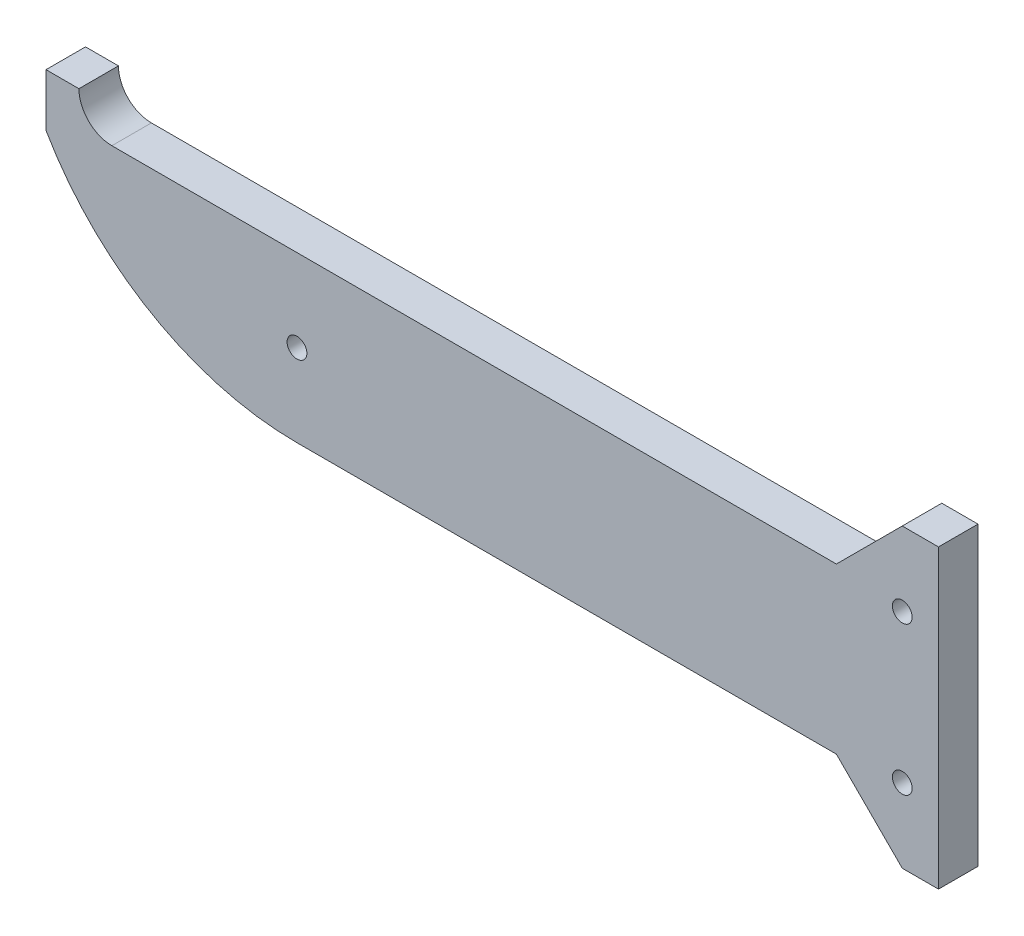
ISO-10303-21;
HEADER;
FILE_DESCRIPTION(('STEP AP214'),'2;1');
FILE_NAME('part.step','',(''),(''),'','','');
FILE_SCHEMA(('AUTOMOTIVE_DESIGN { 1 0 10303 214 1 1 1 1 }'));
ENDSEC;
DATA;
#1=APPLICATION_CONTEXT('core data for automotive mechanical design processes');
#2=APPLICATION_PROTOCOL_DEFINITION('international standard','automotive_design',2000,#1);
#3=PRODUCT_CONTEXT('',#1,'mechanical');
#4=PRODUCT('Part','Part','',(#3));
#5=PRODUCT_RELATED_PRODUCT_CATEGORY('part','',(#4));
#6=PRODUCT_DEFINITION_FORMATION('','',#4);
#7=PRODUCT_DEFINITION_CONTEXT('part definition',#1,'design');
#8=PRODUCT_DEFINITION('design','',#6,#7);
#9=PRODUCT_DEFINITION_SHAPE('','',#8);
#10=(LENGTH_UNIT() NAMED_UNIT(*) SI_UNIT(.MILLI.,.METRE.));
#11=(NAMED_UNIT(*) PLANE_ANGLE_UNIT() SI_UNIT($,.RADIAN.));
#12=(NAMED_UNIT(*) SI_UNIT($,.STERADIAN.) SOLID_ANGLE_UNIT());
#13=UNCERTAINTY_MEASURE_WITH_UNIT(LENGTH_MEASURE(1.E-05),#10,'distance_accuracy_value','');
#14=(GEOMETRIC_REPRESENTATION_CONTEXT(3) GLOBAL_UNCERTAINTY_ASSIGNED_CONTEXT((#13)) GLOBAL_UNIT_ASSIGNED_CONTEXT((#10,
#11,#12)) REPRESENTATION_CONTEXT('',''));
#15=CARTESIAN_POINT('',(0.,0.,0.));
#16=DIRECTION('',(0.,0.,1.));
#17=DIRECTION('',(1.,0.,0.));
#18=AXIS2_PLACEMENT_3D('',#15,#16,#17);
#19=CARTESIAN_POINT('',(38.1051177665153,19.,6.));
#20=DIRECTION('',(0.,0.,1.));
#21=DIRECTION('',(1.,0.,0.));
#22=AXIS2_PLACEMENT_3D('',#19,#20,#21);
#23=PLANE('',#22);
#24=CARTESIAN_POINT('',(130.,-23.75,6.));
#25=DIRECTION('',(0.,0.,1.));
#26=DIRECTION('',(1.,0.,0.));
#27=AXIS2_PLACEMENT_3D('',#24,#25,#26);
#28=CIRCLE('',#27,1.5);
#29=CARTESIAN_POINT('',(131.5,-23.75,6.));
#30=VERTEX_POINT('',#29);
#31=EDGE_CURVE('E237',#30,#30,#28,.T.);
#32=ORIENTED_EDGE('',*,*,#31,.F.);
#33=EDGE_LOOP('',(#32));
#34=FACE_BOUND('',#33,.T.);
#35=CARTESIAN_POINT('',(38.1051177665153,19.,6.));
#36=DIRECTION('',(0.,0.,1.));
#37=DIRECTION('',(1.,0.,0.));
#38=AXIS2_PLACEMENT_3D('',#35,#36,#37);
#39=CIRCLE('',#38,44.);
#40=CARTESIAN_POINT('',(0.,-3.,6.));
#41=VERTEX_POINT('',#40);
#42=CARTESIAN_POINT('',(38.1051177665153,-25.,6.));
#43=VERTEX_POINT('',#42);
#44=EDGE_CURVE('E170',#41,#43,#39,.T.);
#45=ORIENTED_EDGE('',*,*,#44,.T.);
#46=DIRECTION('',(1.,0.,0.));
#47=VECTOR('',#46,1.);
#48=CARTESIAN_POINT('',(120.,-25.,6.));
#49=LINE('',#48,#47);
#50=CARTESIAN_POINT('',(120.,-25.,6.));
#51=VERTEX_POINT('',#50);
#52=EDGE_CURVE('E99',#43,#51,#49,.T.);
#53=ORIENTED_EDGE('',*,*,#52,.T.);
#54=DIRECTION('',(0.707106781186546,-0.707106781186549,0.));
#55=VECTOR('',#54,1.);
#56=CARTESIAN_POINT('',(130.,-35.,6.));
#57=LINE('',#56,#55);
#58=CARTESIAN_POINT('',(130.,-35.,6.));
#59=VERTEX_POINT('',#58);
#60=EDGE_CURVE('E194',#51,#59,#57,.T.);
#61=ORIENTED_EDGE('',*,*,#60,.T.);
#62=DIRECTION('',(1.,0.,0.));
#63=VECTOR('',#62,1.);
#64=CARTESIAN_POINT('',(135.5,-35.,6.));
#65=LINE('',#64,#63);
#66=CARTESIAN_POINT('',(135.5,-35.,6.));
#67=VERTEX_POINT('',#66);
#68=EDGE_CURVE('E211',#59,#67,#65,.T.);
#69=ORIENTED_EDGE('',*,*,#68,.T.);
#70=DIRECTION('',(0.,1.,0.));
#71=VECTOR('',#70,1.);
#72=CARTESIAN_POINT('',(135.5,10.,6.));
#73=LINE('',#72,#71);
#74=CARTESIAN_POINT('',(135.5,10.,6.));
#75=VERTEX_POINT('',#74);
#76=EDGE_CURVE('E208',#67,#75,#73,.T.);
#77=ORIENTED_EDGE('',*,*,#76,.T.);
#78=DIRECTION('',(-1.,0.,0.));
#79=VECTOR('',#78,1.);
#80=CARTESIAN_POINT('',(130.,10.,6.));
#81=LINE('',#80,#79);
#82=CARTESIAN_POINT('',(130.,10.,6.));
#83=VERTEX_POINT('',#82);
#84=EDGE_CURVE('E210',#75,#83,#81,.T.);
#85=ORIENTED_EDGE('',*,*,#84,.T.);
#86=DIRECTION('',(-0.707106781186545,-0.70710678118655,0.));
#87=VECTOR('',#86,1.);
#88=CARTESIAN_POINT('',(120.,0.,6.));
#89=LINE('',#88,#87);
#90=CARTESIAN_POINT('',(120.,0.,6.));
#91=VERTEX_POINT('',#90);
#92=EDGE_CURVE('E213',#83,#91,#89,.T.);
#93=ORIENTED_EDGE('',*,*,#92,.T.);
#94=DIRECTION('',(-1.,0.,0.));
#95=VECTOR('',#94,1.);
#96=CARTESIAN_POINT('',(10.,0.,6.));
#97=LINE('',#96,#95);
#98=CARTESIAN_POINT('',(10.,0.,6.));
#99=VERTEX_POINT('',#98);
#100=EDGE_CURVE('E128',#91,#99,#97,.T.);
#101=ORIENTED_EDGE('',*,*,#100,.T.);
#102=CARTESIAN_POINT('',(10.,5.,6.));
#103=DIRECTION('',(0.,0.,-1.));
#104=DIRECTION('',(1.,0.,0.));
#105=AXIS2_PLACEMENT_3D('',#102,#103,#104);
#106=CIRCLE('',#105,5.);
#107=CARTESIAN_POINT('',(5.,5.,6.));
#108=VERTEX_POINT('',#107);
#109=EDGE_CURVE('E121',#99,#108,#106,.T.);
#110=ORIENTED_EDGE('',*,*,#109,.T.);
#111=DIRECTION('',(-1.,0.,0.));
#112=VECTOR('',#111,1.);
#113=CARTESIAN_POINT('',(0.,5.,6.));
#114=LINE('',#113,#112);
#115=CARTESIAN_POINT('',(0.,5.,6.));
#116=VERTEX_POINT('',#115);
#117=EDGE_CURVE('E125',#108,#116,#114,.T.);
#118=ORIENTED_EDGE('',*,*,#117,.T.);
#119=DIRECTION('',(0.,-1.,0.));
#120=VECTOR('',#119,1.);
#121=CARTESIAN_POINT('',(0.,0.,6.));
#122=LINE('',#121,#120);
#123=EDGE_CURVE('E49',#116,#41,#122,.T.);
#124=ORIENTED_EDGE('',*,*,#123,.T.);
#125=EDGE_LOOP('',(#45,#53,#61,#69,#77,#85,#93,#101,#110,#118,#124));
#126=FACE_BOUND('',#125,.T.);
#127=CARTESIAN_POINT('',(130.,-1.25,6.));
#128=DIRECTION('',(0.,0.,1.));
#129=DIRECTION('',(1.,0.,0.));
#130=AXIS2_PLACEMENT_3D('',#127,#128,#129);
#131=CIRCLE('',#130,1.5);
#132=CARTESIAN_POINT('',(131.5,-1.25,6.));
#133=VERTEX_POINT('',#132);
#134=EDGE_CURVE('E152',#133,#133,#131,.T.);
#135=ORIENTED_EDGE('',*,*,#134,.F.);
#136=EDGE_LOOP('',(#135));
#137=FACE_BOUND('',#136,.T.);
#138=CARTESIAN_POINT('',(38.1051177665153,-12.5,6.));
#139=DIRECTION('',(0.,0.,1.));
#140=DIRECTION('',(1.,0.,0.));
#141=AXIS2_PLACEMENT_3D('',#138,#139,#140);
#142=CIRCLE('',#141,1.5);
#143=CARTESIAN_POINT('',(39.6051177665153,-12.5,6.));
#144=VERTEX_POINT('',#143);
#145=EDGE_CURVE('E243',#144,#144,#142,.T.);
#146=ORIENTED_EDGE('',*,*,#145,.F.);
#147=EDGE_LOOP('',(#146));
#148=FACE_BOUND('',#147,.T.);
#149=ADVANCED_FACE('F32',(#34,#126,#137,#148),#23,.T.);
#150=CARTESIAN_POINT('',(38.1051177665153,19.,0.));
#151=DIRECTION('',(0.,0.,1.));
#152=DIRECTION('',(1.,0.,0.));
#153=AXIS2_PLACEMENT_3D('',#150,#151,#152);
#154=PLANE('',#153);
#155=CARTESIAN_POINT('',(38.1051177665153,19.,0.));
#156=DIRECTION('',(0.,0.,1.));
#157=DIRECTION('',(1.,0.,0.));
#158=AXIS2_PLACEMENT_3D('',#155,#156,#157);
#159=CIRCLE('',#158,44.);
#160=CARTESIAN_POINT('',(0.,-3.,0.));
#161=VERTEX_POINT('',#160);
#162=CARTESIAN_POINT('',(38.1051177665153,-25.,0.));
#163=VERTEX_POINT('',#162);
#164=EDGE_CURVE('E148',#161,#163,#159,.T.);
#165=ORIENTED_EDGE('',*,*,#164,.F.);
#166=DIRECTION('',(0.,-1.,0.));
#167=VECTOR('',#166,1.);
#168=CARTESIAN_POINT('',(0.,0.,0.));
#169=LINE('',#168,#167);
#170=CARTESIAN_POINT('',(0.,5.,0.));
#171=VERTEX_POINT('',#170);
#172=EDGE_CURVE('E87',#171,#161,#169,.T.);
#173=ORIENTED_EDGE('',*,*,#172,.F.);
#174=DIRECTION('',(-1.,0.,0.));
#175=VECTOR('',#174,1.);
#176=CARTESIAN_POINT('',(0.,5.,0.));
#177=LINE('',#176,#175);
#178=CARTESIAN_POINT('',(5.,5.,0.));
#179=VERTEX_POINT('',#178);
#180=EDGE_CURVE('E167',#179,#171,#177,.T.);
#181=ORIENTED_EDGE('',*,*,#180,.F.);
#182=CARTESIAN_POINT('',(10.,5.,0.));
#183=DIRECTION('',(0.,0.,-1.));
#184=DIRECTION('',(1.,0.,0.));
#185=AXIS2_PLACEMENT_3D('',#182,#183,#184);
#186=CIRCLE('',#185,5.);
#187=CARTESIAN_POINT('',(10.,0.,0.));
#188=VERTEX_POINT('',#187);
#189=EDGE_CURVE('E137',#188,#179,#186,.T.);
#190=ORIENTED_EDGE('',*,*,#189,.F.);
#191=DIRECTION('',(-1.,0.,0.));
#192=VECTOR('',#191,1.);
#193=CARTESIAN_POINT('',(10.,0.,0.));
#194=LINE('',#193,#192);
#195=CARTESIAN_POINT('',(120.,0.,0.));
#196=VERTEX_POINT('',#195);
#197=EDGE_CURVE('E164',#196,#188,#194,.T.);
#198=ORIENTED_EDGE('',*,*,#197,.F.);
#199=DIRECTION('',(-0.707106781186545,-0.70710678118655,0.));
#200=VECTOR('',#199,1.);
#201=CARTESIAN_POINT('',(120.,0.,0.));
#202=LINE('',#201,#200);
#203=CARTESIAN_POINT('',(130.,10.,0.));
#204=VERTEX_POINT('',#203);
#205=EDGE_CURVE('E162',#204,#196,#202,.T.);
#206=ORIENTED_EDGE('',*,*,#205,.F.);
#207=DIRECTION('',(-1.,0.,0.));
#208=VECTOR('',#207,1.);
#209=CARTESIAN_POINT('',(130.,10.,0.));
#210=LINE('',#209,#208);
#211=CARTESIAN_POINT('',(135.5,10.,0.));
#212=VERTEX_POINT('',#211);
#213=EDGE_CURVE('E160',#212,#204,#210,.T.);
#214=ORIENTED_EDGE('',*,*,#213,.F.);
#215=DIRECTION('',(0.,1.,0.));
#216=VECTOR('',#215,1.);
#217=CARTESIAN_POINT('',(135.5,10.,0.));
#218=LINE('',#217,#216);
#219=CARTESIAN_POINT('',(135.5,-35.,0.));
#220=VERTEX_POINT('',#219);
#221=EDGE_CURVE('E158',#220,#212,#218,.T.);
#222=ORIENTED_EDGE('',*,*,#221,.F.);
#223=DIRECTION('',(1.,0.,0.));
#224=VECTOR('',#223,1.);
#225=CARTESIAN_POINT('',(135.5,-35.,0.));
#226=LINE('',#225,#224);
#227=CARTESIAN_POINT('',(130.,-35.,0.));
#228=VERTEX_POINT('',#227);
#229=EDGE_CURVE('E156',#228,#220,#226,.T.);
#230=ORIENTED_EDGE('',*,*,#229,.F.);
#231=DIRECTION('',(0.707106781186546,-0.707106781186549,0.));
#232=VECTOR('',#231,1.);
#233=CARTESIAN_POINT('',(130.,-35.,0.));
#234=LINE('',#233,#232);
#235=CARTESIAN_POINT('',(120.,-25.,0.));
#236=VERTEX_POINT('',#235);
#237=EDGE_CURVE('E154',#236,#228,#234,.T.);
#238=ORIENTED_EDGE('',*,*,#237,.F.);
#239=DIRECTION('',(1.,0.,0.));
#240=VECTOR('',#239,1.);
#241=CARTESIAN_POINT('',(120.,-25.,0.));
#242=LINE('',#241,#240);
#243=EDGE_CURVE('E151',#163,#236,#242,.T.);
#244=ORIENTED_EDGE('',*,*,#243,.F.);
#245=EDGE_LOOP('',(#165,#173,#181,#190,#198,#206,#214,#222,#230,#238,#244));
#246=FACE_BOUND('',#245,.T.);
#247=CARTESIAN_POINT('',(130.,-1.25,0.));
#248=DIRECTION('',(0.,0.,1.));
#249=DIRECTION('',(1.,0.,0.));
#250=AXIS2_PLACEMENT_3D('',#247,#248,#249);
#251=CIRCLE('',#250,1.5);
#252=CARTESIAN_POINT('',(131.5,-1.25,0.));
#253=VERTEX_POINT('',#252);
#254=EDGE_CURVE('E234',#253,#253,#251,.T.);
#255=ORIENTED_EDGE('',*,*,#254,.T.);
#256=EDGE_LOOP('',(#255));
#257=FACE_BOUND('',#256,.T.);
#258=CARTESIAN_POINT('',(130.,-23.75,0.));
#259=DIRECTION('',(0.,0.,1.));
#260=DIRECTION('',(1.,0.,0.));
#261=AXIS2_PLACEMENT_3D('',#258,#259,#260);
#262=CIRCLE('',#261,1.5);
#263=CARTESIAN_POINT('',(131.5,-23.75,0.));
#264=VERTEX_POINT('',#263);
#265=EDGE_CURVE('E240',#264,#264,#262,.T.);
#266=ORIENTED_EDGE('',*,*,#265,.T.);
#267=EDGE_LOOP('',(#266));
#268=FACE_BOUND('',#267,.T.);
#269=CARTESIAN_POINT('',(38.1051177665153,-12.5,0.));
#270=DIRECTION('',(0.,0.,1.));
#271=DIRECTION('',(1.,0.,0.));
#272=AXIS2_PLACEMENT_3D('',#269,#270,#271);
#273=CIRCLE('',#272,1.5);
#274=CARTESIAN_POINT('',(39.6051177665153,-12.5,0.));
#275=VERTEX_POINT('',#274);
#276=EDGE_CURVE('E246',#275,#275,#273,.T.);
#277=ORIENTED_EDGE('',*,*,#276,.T.);
#278=EDGE_LOOP('',(#277));
#279=FACE_BOUND('',#278,.T.);
#280=ADVANCED_FACE('F196',(#246,#257,#268,#279),#154,.F.);
#281=CARTESIAN_POINT('',(38.1051177665153,19.,6.));
#282=DIRECTION('',(0.,0.,-1.));
#283=DIRECTION('',(-1.,0.,0.));
#284=AXIS2_PLACEMENT_3D('',#281,#282,#283);
#285=CYLINDRICAL_SURFACE('',#284,44.);
#286=ORIENTED_EDGE('',*,*,#164,.T.);
#287=DIRECTION('',(0.,0.,-1.));
#288=VECTOR('',#287,1.);
#289=CARTESIAN_POINT('',(38.1051177665153,-25.,6.));
#290=LINE('',#289,#288);
#291=EDGE_CURVE('E11',#43,#163,#290,.T.);
#292=ORIENTED_EDGE('',*,*,#291,.F.);
#293=ORIENTED_EDGE('',*,*,#44,.F.);
#294=DIRECTION('',(0.,0.,-1.));
#295=VECTOR('',#294,1.);
#296=CARTESIAN_POINT('',(0.,-3.,6.));
#297=LINE('',#296,#295);
#298=EDGE_CURVE('E144',#41,#161,#297,.T.);
#299=ORIENTED_EDGE('',*,*,#298,.T.);
#300=EDGE_LOOP('',(#286,#292,#293,#299));
#301=FACE_BOUND('',#300,.T.);
#302=ADVANCED_FACE('F34',(#301),#285,.T.);
#303=CARTESIAN_POINT('',(120.,-25.,6.));
#304=DIRECTION('',(0.,1.,0.));
#305=DIRECTION('',(0.,0.,1.));
#306=AXIS2_PLACEMENT_3D('',#303,#304,#305);
#307=PLANE('',#306);
#308=ORIENTED_EDGE('',*,*,#243,.T.);
#309=DIRECTION('',(0.,0.,-1.));
#310=VECTOR('',#309,1.);
#311=CARTESIAN_POINT('',(120.,-25.,6.));
#312=LINE('',#311,#310);
#313=EDGE_CURVE('E41',#51,#236,#312,.T.);
#314=ORIENTED_EDGE('',*,*,#313,.F.);
#315=ORIENTED_EDGE('',*,*,#52,.F.);
#316=ORIENTED_EDGE('',*,*,#291,.T.);
#317=EDGE_LOOP('',(#308,#314,#315,#316));
#318=FACE_BOUND('',#317,.T.);
#319=ADVANCED_FACE('F286',(#318),#307,.F.);
#320=CARTESIAN_POINT('',(130.,-35.,6.));
#321=DIRECTION('',(0.707106781186549,0.707106781186545,0.));
#322=DIRECTION('',(-0.707106781186546,0.707106781186549,0.));
#323=AXIS2_PLACEMENT_3D('',#320,#321,#322);
#324=PLANE('',#323);
#325=ORIENTED_EDGE('',*,*,#237,.T.);
#326=DIRECTION('',(0.,0.,-1.));
#327=VECTOR('',#326,1.);
#328=CARTESIAN_POINT('',(130.,-35.,6.));
#329=LINE('',#328,#327);
#330=EDGE_CURVE('E186',#59,#228,#329,.T.);
#331=ORIENTED_EDGE('',*,*,#330,.F.);
#332=ORIENTED_EDGE('',*,*,#60,.F.);
#333=ORIENTED_EDGE('',*,*,#313,.T.);
#334=EDGE_LOOP('',(#325,#331,#332,#333));
#335=FACE_BOUND('',#334,.T.);
#336=ADVANCED_FACE('F192',(#335),#324,.F.);
#337=CARTESIAN_POINT('',(135.5,-35.,6.));
#338=DIRECTION('',(0.,1.,0.));
#339=DIRECTION('',(0.,0.,1.));
#340=AXIS2_PLACEMENT_3D('',#337,#338,#339);
#341=PLANE('',#340);
#342=ORIENTED_EDGE('',*,*,#229,.T.);
#343=DIRECTION('',(0.,0.,-1.));
#344=VECTOR('',#343,1.);
#345=CARTESIAN_POINT('',(135.5,-35.,6.));
#346=LINE('',#345,#344);
#347=EDGE_CURVE('E183',#67,#220,#346,.T.);
#348=ORIENTED_EDGE('',*,*,#347,.F.);
#349=ORIENTED_EDGE('',*,*,#68,.F.);
#350=ORIENTED_EDGE('',*,*,#330,.T.);
#351=EDGE_LOOP('',(#342,#348,#349,#350));
#352=FACE_BOUND('',#351,.T.);
#353=ADVANCED_FACE('F202',(#352),#341,.F.);
#354=CARTESIAN_POINT('',(135.5,10.,6.));
#355=DIRECTION('',(-1.,0.,0.));
#356=DIRECTION('',(0.,0.,1.));
#357=AXIS2_PLACEMENT_3D('',#354,#355,#356);
#358=PLANE('',#357);
#359=ORIENTED_EDGE('',*,*,#221,.T.);
#360=DIRECTION('',(0.,0.,-1.));
#361=VECTOR('',#360,1.);
#362=CARTESIAN_POINT('',(135.5,10.,6.));
#363=LINE('',#362,#361);
#364=EDGE_CURVE('E180',#75,#212,#363,.T.);
#365=ORIENTED_EDGE('',*,*,#364,.F.);
#366=ORIENTED_EDGE('',*,*,#76,.F.);
#367=ORIENTED_EDGE('',*,*,#347,.T.);
#368=EDGE_LOOP('',(#359,#365,#366,#367));
#369=FACE_BOUND('',#368,.T.);
#370=ADVANCED_FACE('F206',(#369),#358,.F.);
#371=CARTESIAN_POINT('',(130.,10.,6.));
#372=DIRECTION('',(0.,-1.,0.));
#373=DIRECTION('',(0.,0.,-1.));
#374=AXIS2_PLACEMENT_3D('',#371,#372,#373);
#375=PLANE('',#374);
#376=ORIENTED_EDGE('',*,*,#213,.T.);
#377=DIRECTION('',(0.,0.,-1.));
#378=VECTOR('',#377,1.);
#379=CARTESIAN_POINT('',(130.,10.,6.));
#380=LINE('',#379,#378);
#381=EDGE_CURVE('E177',#83,#204,#380,.T.);
#382=ORIENTED_EDGE('',*,*,#381,.F.);
#383=ORIENTED_EDGE('',*,*,#84,.F.);
#384=ORIENTED_EDGE('',*,*,#364,.T.);
#385=EDGE_LOOP('',(#376,#382,#383,#384));
#386=FACE_BOUND('',#385,.T.);
#387=ADVANCED_FACE('F277',(#386),#375,.F.);
#388=CARTESIAN_POINT('',(120.,0.,6.));
#389=DIRECTION('',(0.70710678118655,-0.707106781186545,0.));
#390=DIRECTION('',(0.707106781186545,0.70710678118655,0.));
#391=AXIS2_PLACEMENT_3D('',#388,#389,#390);
#392=PLANE('',#391);
#393=ORIENTED_EDGE('',*,*,#205,.T.);
#394=DIRECTION('',(0.,0.,-1.));
#395=VECTOR('',#394,1.);
#396=CARTESIAN_POINT('',(120.,0.,6.));
#397=LINE('',#396,#395);
#398=EDGE_CURVE('E174',#91,#196,#397,.T.);
#399=ORIENTED_EDGE('',*,*,#398,.F.);
#400=ORIENTED_EDGE('',*,*,#92,.F.);
#401=ORIENTED_EDGE('',*,*,#381,.T.);
#402=EDGE_LOOP('',(#393,#399,#400,#401));
#403=FACE_BOUND('',#402,.T.);
#404=ADVANCED_FACE('F222',(#403),#392,.F.);
#405=CARTESIAN_POINT('',(10.,0.,6.));
#406=DIRECTION('',(0.,-1.,0.));
#407=DIRECTION('',(0.,0.,-1.));
#408=AXIS2_PLACEMENT_3D('',#405,#406,#407);
#409=PLANE('',#408);
#410=ORIENTED_EDGE('',*,*,#197,.T.);
#411=DIRECTION('',(0.,0.,-1.));
#412=VECTOR('',#411,1.);
#413=CARTESIAN_POINT('',(10.,0.,6.));
#414=LINE('',#413,#412);
#415=EDGE_CURVE('E139',#99,#188,#414,.T.);
#416=ORIENTED_EDGE('',*,*,#415,.F.);
#417=ORIENTED_EDGE('',*,*,#100,.F.);
#418=ORIENTED_EDGE('',*,*,#398,.T.);
#419=EDGE_LOOP('',(#410,#416,#417,#418));
#420=FACE_BOUND('',#419,.T.);
#421=ADVANCED_FACE('F226',(#420),#409,.F.);
#422=CARTESIAN_POINT('',(10.,5.,6.));
#423=DIRECTION('',(0.,0.,-1.));
#424=DIRECTION('',(-1.,0.,0.));
#425=AXIS2_PLACEMENT_3D('',#422,#423,#424);
#426=CYLINDRICAL_SURFACE('',#425,5.);
#427=ORIENTED_EDGE('',*,*,#189,.T.);
#428=DIRECTION('',(0.,0.,-1.));
#429=VECTOR('',#428,1.);
#430=CARTESIAN_POINT('',(5.,5.,6.));
#431=LINE('',#430,#429);
#432=EDGE_CURVE('E134',#108,#179,#431,.T.);
#433=ORIENTED_EDGE('',*,*,#432,.F.);
#434=ORIENTED_EDGE('',*,*,#109,.F.);
#435=ORIENTED_EDGE('',*,*,#415,.T.);
#436=EDGE_LOOP('',(#427,#433,#434,#435));
#437=FACE_BOUND('',#436,.T.);
#438=ADVANCED_FACE('F135',(#437),#426,.F.);
#439=CARTESIAN_POINT('',(0.,5.,6.));
#440=DIRECTION('',(0.,-1.,0.));
#441=DIRECTION('',(1.,0.,0.));
#442=AXIS2_PLACEMENT_3D('',#439,#440,#441);
#443=PLANE('',#442);
#444=ORIENTED_EDGE('',*,*,#180,.T.);
#445=DIRECTION('',(0.,0.,-1.));
#446=VECTOR('',#445,1.);
#447=CARTESIAN_POINT('',(0.,5.,6.));
#448=LINE('',#447,#446);
#449=EDGE_CURVE('E140',#116,#171,#448,.T.);
#450=ORIENTED_EDGE('',*,*,#449,.F.);
#451=ORIENTED_EDGE('',*,*,#117,.F.);
#452=ORIENTED_EDGE('',*,*,#432,.T.);
#453=EDGE_LOOP('',(#444,#450,#451,#452));
#454=FACE_BOUND('',#453,.T.);
#455=ADVANCED_FACE('F142',(#454),#443,.F.);
#456=CARTESIAN_POINT('',(0.,0.,6.));
#457=DIRECTION('',(1.,0.,0.));
#458=DIRECTION('',(0.,1.,0.));
#459=AXIS2_PLACEMENT_3D('',#456,#457,#458);
#460=PLANE('',#459);
#461=ORIENTED_EDGE('',*,*,#172,.T.);
#462=ORIENTED_EDGE('',*,*,#298,.F.);
#463=ORIENTED_EDGE('',*,*,#123,.F.);
#464=ORIENTED_EDGE('',*,*,#449,.T.);
#465=EDGE_LOOP('',(#461,#462,#463,#464));
#466=FACE_BOUND('',#465,.T.);
#467=ADVANCED_FACE('F227',(#466),#460,.F.);
#468=CARTESIAN_POINT('',(130.,-1.25,6.));
#469=DIRECTION('',(0.,0.,-1.));
#470=DIRECTION('',(-1.,0.,0.));
#471=AXIS2_PLACEMENT_3D('',#468,#469,#470);
#472=CYLINDRICAL_SURFACE('',#471,1.5);
#473=ORIENTED_EDGE('',*,*,#134,.T.);
#474=EDGE_LOOP('',(#473));
#475=FACE_BOUND('',#474,.T.);
#476=ORIENTED_EDGE('',*,*,#254,.F.);
#477=EDGE_LOOP('',(#476));
#478=FACE_BOUND('',#477,.T.);
#479=ADVANCED_FACE('F264',(#475,#478),#472,.F.);
#480=CARTESIAN_POINT('',(130.,-23.75,6.));
#481=DIRECTION('',(0.,0.,-1.));
#482=DIRECTION('',(-1.,0.,0.));
#483=AXIS2_PLACEMENT_3D('',#480,#481,#482);
#484=CYLINDRICAL_SURFACE('',#483,1.5);
#485=ORIENTED_EDGE('',*,*,#31,.T.);
#486=EDGE_LOOP('',(#485));
#487=FACE_BOUND('',#486,.T.);
#488=ORIENTED_EDGE('',*,*,#265,.F.);
#489=EDGE_LOOP('',(#488));
#490=FACE_BOUND('',#489,.T.);
#491=ADVANCED_FACE('F365',(#487,#490),#484,.F.);
#492=CARTESIAN_POINT('',(38.1051177665153,-12.5,6.));
#493=DIRECTION('',(0.,0.,-1.));
#494=DIRECTION('',(-1.,0.,0.));
#495=AXIS2_PLACEMENT_3D('',#492,#493,#494);
#496=CYLINDRICAL_SURFACE('',#495,1.5);
#497=ORIENTED_EDGE('',*,*,#145,.T.);
#498=EDGE_LOOP('',(#497));
#499=FACE_BOUND('',#498,.T.);
#500=ORIENTED_EDGE('',*,*,#276,.F.);
#501=EDGE_LOOP('',(#500));
#502=FACE_BOUND('',#501,.T.);
#503=ADVANCED_FACE('F252',(#499,#502),#496,.F.);
#504=CLOSED_SHELL('',(#149,#280,#302,#319,#336,#353,#370,#387,#404,#421,#438,#455,#467,#479,
#491,#503));
#505=MANIFOLD_SOLID_BREP('B2',#504);
#506=ADVANCED_BREP_SHAPE_REPRESENTATION('',(#18,#505),#14);
#507=SHAPE_DEFINITION_REPRESENTATION(#9,#506);
ENDSEC;
END-ISO-10303-21;
